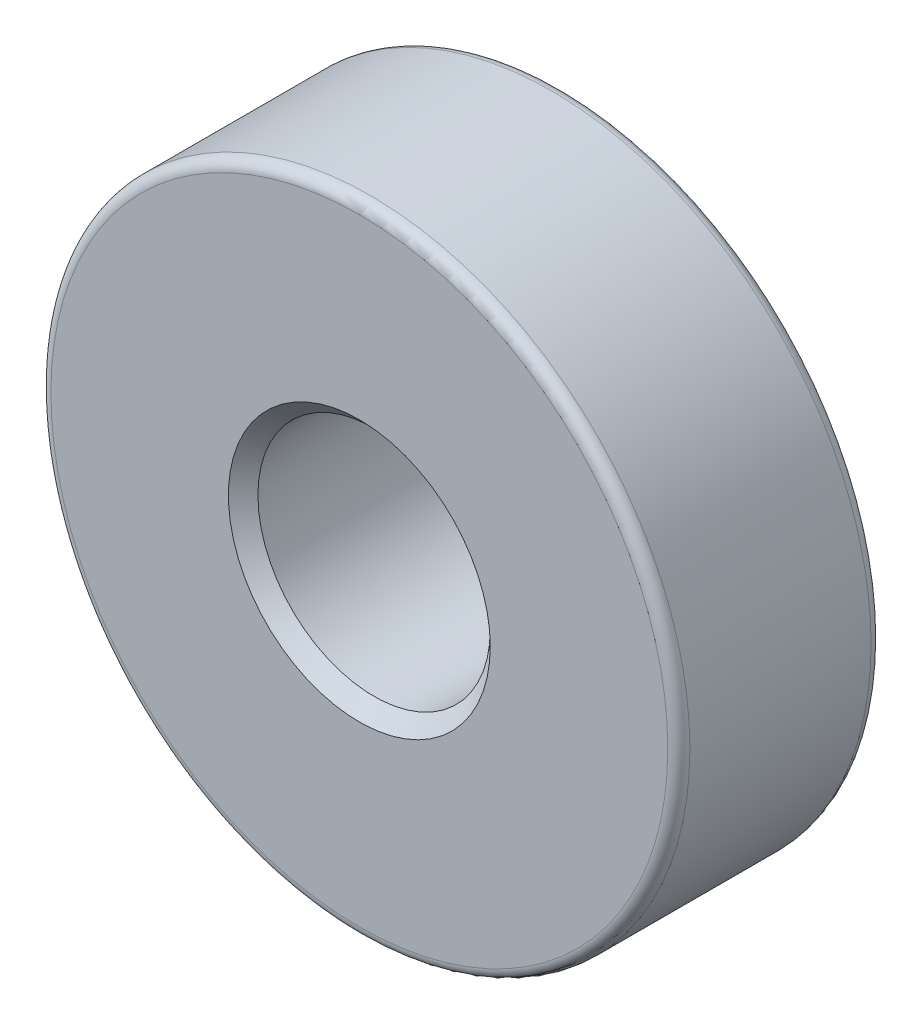
ISO-10303-21;
HEADER;
FILE_DESCRIPTION(('STEP AP214'),'2;1');
FILE_NAME('part.step','',(''),(''),'','','');
FILE_SCHEMA(('AUTOMOTIVE_DESIGN { 1 0 10303 214 1 1 1 1 }'));
ENDSEC;
DATA;
#1=APPLICATION_CONTEXT('core data for automotive mechanical design processes');
#2=APPLICATION_PROTOCOL_DEFINITION('international standard','automotive_design',2000,#1);
#3=PRODUCT_CONTEXT('',#1,'mechanical');
#4=PRODUCT('Part','Part','',(#3));
#5=PRODUCT_RELATED_PRODUCT_CATEGORY('part','',(#4));
#6=PRODUCT_DEFINITION_FORMATION('','',#4);
#7=PRODUCT_DEFINITION_CONTEXT('part definition',#1,'design');
#8=PRODUCT_DEFINITION('design','',#6,#7);
#9=PRODUCT_DEFINITION_SHAPE('','',#8);
#10=(LENGTH_UNIT() NAMED_UNIT(*) SI_UNIT(.MILLI.,.METRE.));
#11=(NAMED_UNIT(*) PLANE_ANGLE_UNIT() SI_UNIT($,.RADIAN.));
#12=(NAMED_UNIT(*) SI_UNIT($,.STERADIAN.) SOLID_ANGLE_UNIT());
#13=UNCERTAINTY_MEASURE_WITH_UNIT(LENGTH_MEASURE(1.E-05),#10,'distance_accuracy_value','');
#14=(GEOMETRIC_REPRESENTATION_CONTEXT(3) GLOBAL_UNCERTAINTY_ASSIGNED_CONTEXT((#13)) GLOBAL_UNIT_ASSIGNED_CONTEXT((#10,
#11,#12)) REPRESENTATION_CONTEXT('',''));
#15=CARTESIAN_POINT('',(0.,0.,0.));
#16=DIRECTION('',(0.,0.,1.));
#17=DIRECTION('',(1.,0.,0.));
#18=AXIS2_PLACEMENT_3D('',#15,#16,#17);
#19=CARTESIAN_POINT('',(0.,0.,7.));
#20=DIRECTION('',(0.,0.,1.));
#21=DIRECTION('',(1.,0.,0.));
#22=AXIS2_PLACEMENT_3D('',#19,#20,#21);
#23=PLANE('',#22);
#24=CARTESIAN_POINT('',(0.,0.,7.));
#25=DIRECTION('',(0.,0.,1.));
#26=DIRECTION('',(1.,0.,0.));
#27=AXIS2_PLACEMENT_3D('',#24,#25,#26);
#28=CIRCLE('',#27,4.50800000000001);
#29=CARTESIAN_POINT('',(4.50800000000001,0.,7.));
#30=VERTEX_POINT('',#29);
#31=EDGE_CURVE('E10',#30,#30,#28,.F.);
#32=ORIENTED_EDGE('',*,*,#31,.T.);
#33=EDGE_LOOP('',(#32));
#34=FACE_BOUND('',#33,.T.);
#35=CARTESIAN_POINT('',(0.,0.,7.));
#36=DIRECTION('',(0.,0.,1.));
#37=DIRECTION('',(1.,0.,0.));
#38=AXIS2_PLACEMENT_3D('',#35,#36,#37);
#39=CIRCLE('',#38,10.619);
#40=CARTESIAN_POINT('',(10.619,0.,7.));
#41=VERTEX_POINT('',#40);
#42=EDGE_CURVE('E50',#41,#41,#39,.T.);
#43=ORIENTED_EDGE('',*,*,#42,.T.);
#44=EDGE_LOOP('',(#43));
#45=FACE_BOUND('',#44,.T.);
#46=ADVANCED_FACE('F30',(#34,#45),#23,.T.);
#47=CARTESIAN_POINT('',(0.,0.,0.));
#48=DIRECTION('',(0.,0.,1.));
#49=DIRECTION('',(1.,0.,0.));
#50=AXIS2_PLACEMENT_3D('',#47,#48,#49);
#51=PLANE('',#50);
#52=CARTESIAN_POINT('',(0.,0.,0.));
#53=DIRECTION('',(0.,0.,1.));
#54=DIRECTION('',(1.,0.,0.));
#55=AXIS2_PLACEMENT_3D('',#52,#53,#54);
#56=CIRCLE('',#55,4.508);
#57=CARTESIAN_POINT('',(4.508,0.,0.));
#58=VERTEX_POINT('',#57);
#59=EDGE_CURVE('E45',#58,#58,#56,.T.);
#60=ORIENTED_EDGE('',*,*,#59,.T.);
#61=EDGE_LOOP('',(#60));
#62=FACE_BOUND('',#61,.T.);
#63=CARTESIAN_POINT('',(0.,0.,0.));
#64=DIRECTION('',(0.,0.,1.));
#65=DIRECTION('',(1.,0.,0.));
#66=AXIS2_PLACEMENT_3D('',#63,#64,#65);
#67=CIRCLE('',#66,10.619);
#68=CARTESIAN_POINT('',(10.619,0.,0.));
#69=VERTEX_POINT('',#68);
#70=EDGE_CURVE('E53',#69,#69,#67,.F.);
#71=ORIENTED_EDGE('',*,*,#70,.T.);
#72=EDGE_LOOP('',(#71));
#73=FACE_BOUND('',#72,.T.);
#74=ADVANCED_FACE('F74',(#62,#73),#51,.F.);
#75=CARTESIAN_POINT('',(0.,0.,7.));
#76=DIRECTION('',(0.,0.,-1.));
#77=DIRECTION('',(-1.,0.,0.));
#78=AXIS2_PLACEMENT_3D('',#75,#76,#77);
#79=CYLINDRICAL_SURFACE('',#78,11.);
#80=CARTESIAN_POINT('',(0.,0.,0.381));
#81=DIRECTION('',(0.,0.,1.));
#82=DIRECTION('',(1.,0.,0.));
#83=AXIS2_PLACEMENT_3D('',#80,#81,#82);
#84=CIRCLE('',#83,11.);
#85=CARTESIAN_POINT('',(11.,0.,0.381));
#86=VERTEX_POINT('',#85);
#87=EDGE_CURVE('E56',#86,#86,#84,.T.);
#88=ORIENTED_EDGE('',*,*,#87,.T.);
#89=EDGE_LOOP('',(#88));
#90=FACE_BOUND('',#89,.T.);
#91=CARTESIAN_POINT('',(0.,0.,6.619));
#92=DIRECTION('',(0.,0.,1.));
#93=DIRECTION('',(1.,0.,0.));
#94=AXIS2_PLACEMENT_3D('',#91,#92,#93);
#95=CIRCLE('',#94,11.);
#96=CARTESIAN_POINT('',(11.,0.,6.619));
#97=VERTEX_POINT('',#96);
#98=EDGE_CURVE('E59',#97,#97,#95,.F.);
#99=ORIENTED_EDGE('',*,*,#98,.T.);
#100=EDGE_LOOP('',(#99));
#101=FACE_BOUND('',#100,.T.);
#102=ADVANCED_FACE('F63',(#90,#101),#79,.T.);
#103=CARTESIAN_POINT('',(0.,0.,7.));
#104=DIRECTION('',(0.,0.,-1.));
#105=DIRECTION('',(-1.,0.,0.));
#106=AXIS2_PLACEMENT_3D('',#103,#104,#105);
#107=CYLINDRICAL_SURFACE('',#106,4.);
#108=CARTESIAN_POINT('',(0.,0.,0.508000000000002));
#109=DIRECTION('',(0.,0.,1.));
#110=DIRECTION('',(1.,0.,0.));
#111=AXIS2_PLACEMENT_3D('',#108,#109,#110);
#112=CIRCLE('',#111,4.);
#113=CARTESIAN_POINT('',(4.,0.,0.508000000000002));
#114=VERTEX_POINT('',#113);
#115=EDGE_CURVE('E37',#114,#114,#112,.F.);
#116=ORIENTED_EDGE('',*,*,#115,.T.);
#117=EDGE_LOOP('',(#116));
#118=FACE_BOUND('',#117,.T.);
#119=CARTESIAN_POINT('',(0.,0.,6.492));
#120=DIRECTION('',(0.,0.,1.));
#121=DIRECTION('',(1.,0.,0.));
#122=AXIS2_PLACEMENT_3D('',#119,#120,#121);
#123=CIRCLE('',#122,4.);
#124=CARTESIAN_POINT('',(4.,0.,6.492));
#125=VERTEX_POINT('',#124);
#126=EDGE_CURVE('E41',#125,#125,#123,.T.);
#127=ORIENTED_EDGE('',*,*,#126,.T.);
#128=EDGE_LOOP('',(#127));
#129=FACE_BOUND('',#128,.T.);
#130=ADVANCED_FACE('F82',(#118,#129),#107,.F.);
#131=CARTESIAN_POINT('',(0.,0.,0.381));
#132=DIRECTION('',(0.,0.,1.));
#133=DIRECTION('',(1.,0.,0.));
#134=AXIS2_PLACEMENT_3D('',#131,#132,#133);
#135=TOROIDAL_SURFACE('',#134,10.619,0.381);
#136=ORIENTED_EDGE('',*,*,#70,.F.);
#137=EDGE_LOOP('',(#136));
#138=FACE_BOUND('',#137,.T.);
#139=ORIENTED_EDGE('',*,*,#87,.F.);
#140=EDGE_LOOP('',(#139));
#141=FACE_BOUND('',#140,.T.);
#142=ADVANCED_FACE('F69',(#138,#141),#135,.T.);
#143=CARTESIAN_POINT('',(0.,0.,6.619));
#144=DIRECTION('',(0.,0.,1.));
#145=DIRECTION('',(1.,0.,0.));
#146=AXIS2_PLACEMENT_3D('',#143,#144,#145);
#147=TOROIDAL_SURFACE('',#146,10.619,0.381);
#148=ORIENTED_EDGE('',*,*,#98,.F.);
#149=EDGE_LOOP('',(#148));
#150=FACE_BOUND('',#149,.T.);
#151=ORIENTED_EDGE('',*,*,#42,.F.);
#152=EDGE_LOOP('',(#151));
#153=FACE_BOUND('',#152,.T.);
#154=ADVANCED_FACE('F65',(#150,#153),#147,.T.);
#155=CARTESIAN_POINT('',(0.,0.,0.));
#156=DIRECTION('',(0.,0.,-1.));
#157=DIRECTION('',(-1.,0.,0.));
#158=AXIS2_PLACEMENT_3D('',#155,#156,#157);
#159=CONICAL_SURFACE('',#158,4.508,0.785398163397445);
#160=ORIENTED_EDGE('',*,*,#115,.F.);
#161=EDGE_LOOP('',(#160));
#162=FACE_BOUND('',#161,.T.);
#163=ORIENTED_EDGE('',*,*,#59,.F.);
#164=EDGE_LOOP('',(#163));
#165=FACE_BOUND('',#164,.T.);
#166=ADVANCED_FACE('F68',(#162,#165),#159,.F.);
#167=CARTESIAN_POINT('',(0.,0.,6.492));
#168=DIRECTION('',(0.,0.,1.));
#169=DIRECTION('',(1.,0.,0.));
#170=AXIS2_PLACEMENT_3D('',#167,#168,#169);
#171=CONICAL_SURFACE('',#170,4.,0.785398163397452);
#172=ORIENTED_EDGE('',*,*,#31,.F.);
#173=EDGE_LOOP('',(#172));
#174=FACE_BOUND('',#173,.T.);
#175=ORIENTED_EDGE('',*,*,#126,.F.);
#176=EDGE_LOOP('',(#175));
#177=FACE_BOUND('',#176,.T.);
#178=ADVANCED_FACE('F32',(#174,#177),#171,.F.);
#179=CLOSED_SHELL('',(#46,#74,#102,#130,#142,#154,#166,#178));
#180=MANIFOLD_SOLID_BREP('B2',#179);
#181=ADVANCED_BREP_SHAPE_REPRESENTATION('',(#18,#180),#14);
#182=SHAPE_DEFINITION_REPRESENTATION(#9,#181);
ENDSEC;
END-ISO-10303-21;
